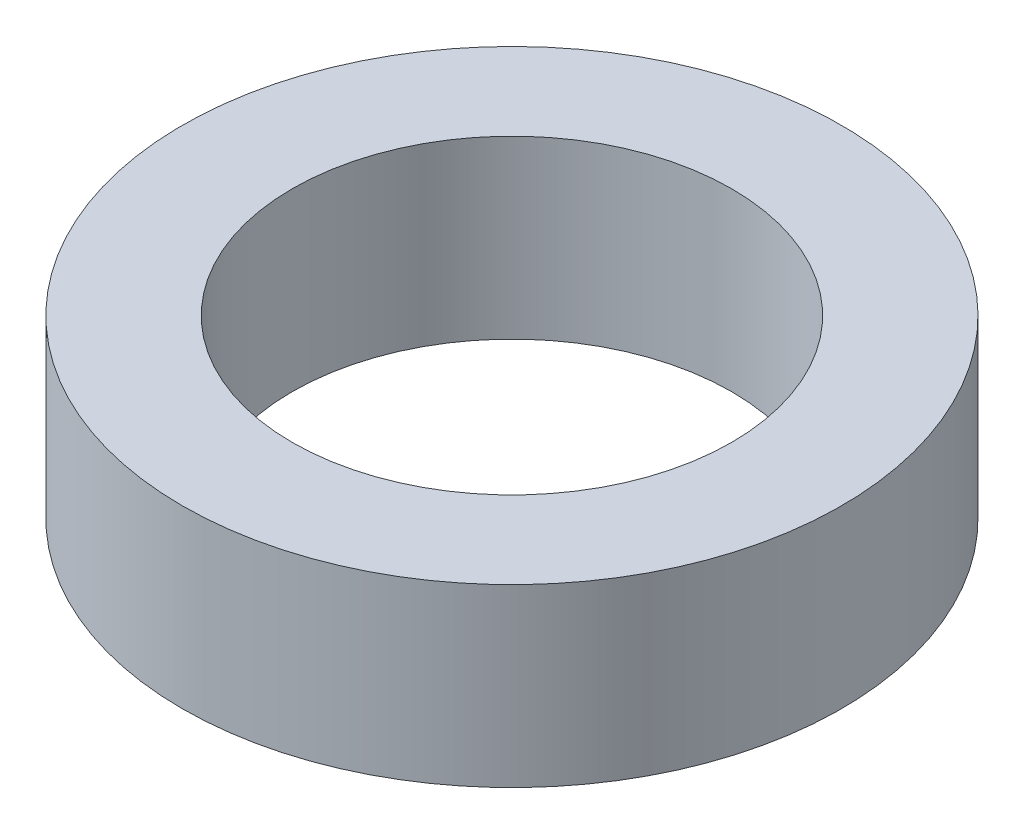
ISO-10303-21;
HEADER;
FILE_DESCRIPTION(('STEP AP214'),'2;1');
FILE_NAME('part.step','',(''),(''),'','','');
FILE_SCHEMA(('AUTOMOTIVE_DESIGN { 1 0 10303 214 1 1 1 1 }'));
ENDSEC;
DATA;
#1=APPLICATION_CONTEXT('core data for automotive mechanical design processes');
#2=APPLICATION_PROTOCOL_DEFINITION('international standard','automotive_design',2000,#1);
#3=PRODUCT_CONTEXT('',#1,'mechanical');
#4=PRODUCT('Part','Part','',(#3));
#5=PRODUCT_RELATED_PRODUCT_CATEGORY('part','',(#4));
#6=PRODUCT_DEFINITION_FORMATION('','',#4);
#7=PRODUCT_DEFINITION_CONTEXT('part definition',#1,'design');
#8=PRODUCT_DEFINITION('design','',#6,#7);
#9=PRODUCT_DEFINITION_SHAPE('','',#8);
#10=(LENGTH_UNIT() NAMED_UNIT(*) SI_UNIT(.MILLI.,.METRE.));
#11=(NAMED_UNIT(*) PLANE_ANGLE_UNIT() SI_UNIT($,.RADIAN.));
#12=(NAMED_UNIT(*) SI_UNIT($,.STERADIAN.) SOLID_ANGLE_UNIT());
#13=UNCERTAINTY_MEASURE_WITH_UNIT(LENGTH_MEASURE(1.E-05),#10,'distance_accuracy_value','');
#14=(GEOMETRIC_REPRESENTATION_CONTEXT(3) GLOBAL_UNCERTAINTY_ASSIGNED_CONTEXT((#13)) GLOBAL_UNIT_ASSIGNED_CONTEXT((#10,
#11,#12)) REPRESENTATION_CONTEXT('',''));
#15=CARTESIAN_POINT('',(0.,0.,0.));
#16=DIRECTION('',(0.,0.,1.));
#17=DIRECTION('',(1.,0.,0.));
#18=AXIS2_PLACEMENT_3D('',#15,#16,#17);
#19=CARTESIAN_POINT('',(0.,4.,0.));
#20=DIRECTION('',(0.,1.,0.));
#21=DIRECTION('',(0.,0.,1.));
#22=AXIS2_PLACEMENT_3D('',#19,#20,#21);
#23=PLANE('',#22);
#24=CARTESIAN_POINT('',(0.,4.,0.));
#25=DIRECTION('',(0.,1.,0.));
#26=DIRECTION('',(0.,0.,1.));
#27=AXIS2_PLACEMENT_3D('',#24,#25,#26);
#28=CIRCLE('',#27,7.5);
#29=CARTESIAN_POINT('',(0.,4.,7.5));
#30=VERTEX_POINT('',#29);
#31=EDGE_CURVE('E10',#30,#30,#28,.T.);
#32=ORIENTED_EDGE('',*,*,#31,.T.);
#33=EDGE_LOOP('',(#32));
#34=FACE_BOUND('',#33,.T.);
#35=CARTESIAN_POINT('',(0.,4.,0.));
#36=DIRECTION('',(0.,1.,0.));
#37=DIRECTION('',(0.,0.,1.));
#38=AXIS2_PLACEMENT_3D('',#35,#36,#37);
#39=CIRCLE('',#38,5.);
#40=CARTESIAN_POINT('',(0.,4.,5.));
#41=VERTEX_POINT('',#40);
#42=EDGE_CURVE('E47',#41,#41,#39,.T.);
#43=ORIENTED_EDGE('',*,*,#42,.F.);
#44=EDGE_LOOP('',(#43));
#45=FACE_BOUND('',#44,.T.);
#46=ADVANCED_FACE('F36',(#34,#45),#23,.T.);
#47=CARTESIAN_POINT('',(0.,0.,0.));
#48=DIRECTION('',(0.,1.,0.));
#49=DIRECTION('',(0.,0.,1.));
#50=AXIS2_PLACEMENT_3D('',#47,#48,#49);
#51=PLANE('',#50);
#52=CARTESIAN_POINT('',(0.,0.,0.));
#53=DIRECTION('',(0.,1.,0.));
#54=DIRECTION('',(0.,0.,1.));
#55=AXIS2_PLACEMENT_3D('',#52,#53,#54);
#56=CIRCLE('',#55,7.5);
#57=CARTESIAN_POINT('',(0.,0.,7.5));
#58=VERTEX_POINT('',#57);
#59=EDGE_CURVE('E40',#58,#58,#56,.T.);
#60=ORIENTED_EDGE('',*,*,#59,.F.);
#61=EDGE_LOOP('',(#60));
#62=FACE_BOUND('',#61,.T.);
#63=CARTESIAN_POINT('',(0.,0.,0.));
#64=DIRECTION('',(0.,1.,0.));
#65=DIRECTION('',(0.,0.,1.));
#66=AXIS2_PLACEMENT_3D('',#63,#64,#65);
#67=CIRCLE('',#66,5.);
#68=CARTESIAN_POINT('',(0.,0.,5.));
#69=VERTEX_POINT('',#68);
#70=EDGE_CURVE('E49',#69,#69,#67,.T.);
#71=ORIENTED_EDGE('',*,*,#70,.T.);
#72=EDGE_LOOP('',(#71));
#73=FACE_BOUND('',#72,.T.);
#74=ADVANCED_FACE('F59',(#62,#73),#51,.F.);
#75=CARTESIAN_POINT('',(0.,4.,0.));
#76=DIRECTION('',(0.,-1.,0.));
#77=DIRECTION('',(0.,0.,-1.));
#78=AXIS2_PLACEMENT_3D('',#75,#76,#77);
#79=CYLINDRICAL_SURFACE('',#78,7.5);
#80=ORIENTED_EDGE('',*,*,#31,.F.);
#81=EDGE_LOOP('',(#80));
#82=FACE_BOUND('',#81,.T.);
#83=ORIENTED_EDGE('',*,*,#59,.T.);
#84=EDGE_LOOP('',(#83));
#85=FACE_BOUND('',#84,.T.);
#86=ADVANCED_FACE('F38',(#82,#85),#79,.T.);
#87=CARTESIAN_POINT('',(0.,4.,0.));
#88=DIRECTION('',(0.,-1.,0.));
#89=DIRECTION('',(0.,0.,-1.));
#90=AXIS2_PLACEMENT_3D('',#87,#88,#89);
#91=CYLINDRICAL_SURFACE('',#90,5.);
#92=ORIENTED_EDGE('',*,*,#42,.T.);
#93=EDGE_LOOP('',(#92));
#94=FACE_BOUND('',#93,.T.);
#95=ORIENTED_EDGE('',*,*,#70,.F.);
#96=EDGE_LOOP('',(#95));
#97=FACE_BOUND('',#96,.T.);
#98=ADVANCED_FACE('F55',(#94,#97),#91,.F.);
#99=CLOSED_SHELL('',(#46,#74,#86,#98));
#100=MANIFOLD_SOLID_BREP('B2',#99);
#101=ADVANCED_BREP_SHAPE_REPRESENTATION('',(#18,#100),#14);
#102=SHAPE_DEFINITION_REPRESENTATION(#9,#101);
ENDSEC;
END-ISO-10303-21;
